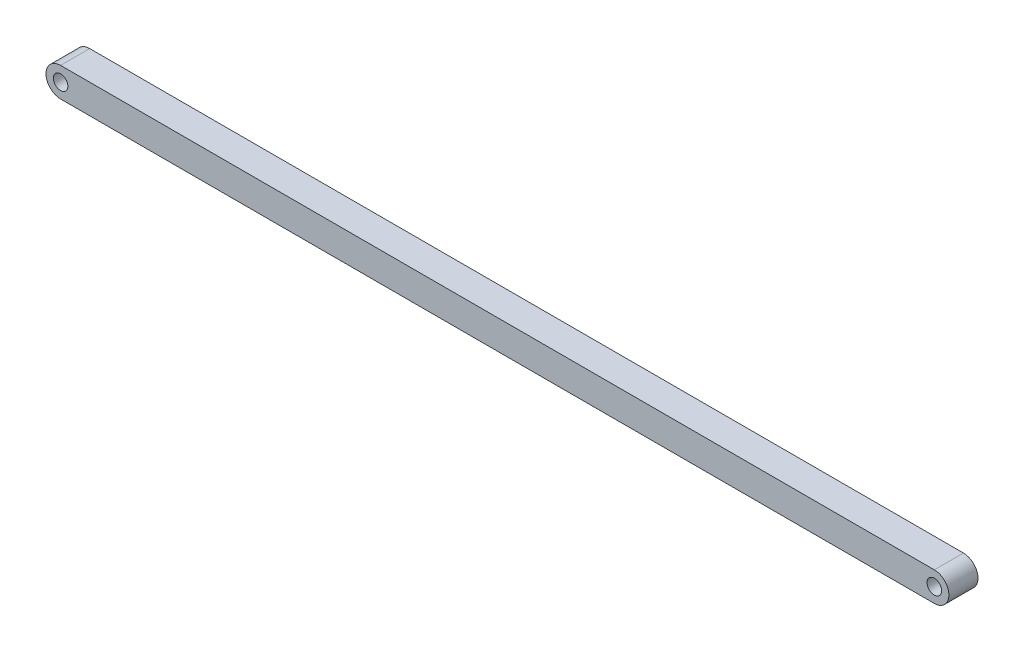
ISO-10303-21;
HEADER;
FILE_DESCRIPTION(('STEP AP214'),'2;1');
FILE_NAME('part.step','',(''),(''),'','','');
FILE_SCHEMA(('AUTOMOTIVE_DESIGN { 1 0 10303 214 1 1 1 1 }'));
ENDSEC;
DATA;
#1=APPLICATION_CONTEXT('core data for automotive mechanical design processes');
#2=APPLICATION_PROTOCOL_DEFINITION('international standard','automotive_design',2000,#1);
#3=PRODUCT_CONTEXT('',#1,'mechanical');
#4=PRODUCT('Part','Part','',(#3));
#5=PRODUCT_RELATED_PRODUCT_CATEGORY('part','',(#4));
#6=PRODUCT_DEFINITION_FORMATION('','',#4);
#7=PRODUCT_DEFINITION_CONTEXT('part definition',#1,'design');
#8=PRODUCT_DEFINITION('design','',#6,#7);
#9=PRODUCT_DEFINITION_SHAPE('','',#8);
#10=(LENGTH_UNIT() NAMED_UNIT(*) SI_UNIT(.MILLI.,.METRE.));
#11=(NAMED_UNIT(*) PLANE_ANGLE_UNIT() SI_UNIT($,.RADIAN.));
#12=(NAMED_UNIT(*) SI_UNIT($,.STERADIAN.) SOLID_ANGLE_UNIT());
#13=UNCERTAINTY_MEASURE_WITH_UNIT(LENGTH_MEASURE(1.E-05),#10,'distance_accuracy_value','');
#14=(GEOMETRIC_REPRESENTATION_CONTEXT(3) GLOBAL_UNCERTAINTY_ASSIGNED_CONTEXT((#13)) GLOBAL_UNIT_ASSIGNED_CONTEXT((#10,
#11,#12)) REPRESENTATION_CONTEXT('',''));
#15=CARTESIAN_POINT('',(0.,0.,0.));
#16=DIRECTION('',(0.,0.,1.));
#17=DIRECTION('',(1.,0.,0.));
#18=AXIS2_PLACEMENT_3D('',#15,#16,#17);
#19=CARTESIAN_POINT('',(-75.,0.,5.));
#20=DIRECTION('',(0.,0.,1.));
#21=DIRECTION('',(1.,0.,0.));
#22=AXIS2_PLACEMENT_3D('',#19,#20,#21);
#23=PLANE('',#22);
#24=CARTESIAN_POINT('',(75.,0.,5.));
#25=DIRECTION('',(0.,0.,1.));
#26=DIRECTION('',(1.,0.,0.));
#27=AXIS2_PLACEMENT_3D('',#24,#25,#26);
#28=CIRCLE('',#27,1.25);
#29=CARTESIAN_POINT('',(76.25,0.,5.));
#30=VERTEX_POINT('',#29);
#31=EDGE_CURVE('E141',#30,#30,#28,.T.);
#32=ORIENTED_EDGE('',*,*,#31,.F.);
#33=EDGE_LOOP('',(#32));
#34=FACE_BOUND('',#33,.T.);
#35=CARTESIAN_POINT('',(-75.,0.,5.));
#36=DIRECTION('',(0.,0.,1.));
#37=DIRECTION('',(1.,0.,0.));
#38=AXIS2_PLACEMENT_3D('',#35,#36,#37);
#39=CIRCLE('',#38,2.5);
#40=CARTESIAN_POINT('',(-75.,2.5,5.));
#41=VERTEX_POINT('',#40);
#42=CARTESIAN_POINT('',(-75.,-2.5,5.));
#43=VERTEX_POINT('',#42);
#44=EDGE_CURVE('E120',#41,#43,#39,.T.);
#45=ORIENTED_EDGE('',*,*,#44,.T.);
#46=DIRECTION('',(1.,0.,0.));
#47=VECTOR('',#46,1.);
#48=CARTESIAN_POINT('',(-75.,-2.5,5.));
#49=LINE('',#48,#47);
#50=CARTESIAN_POINT('',(75.,-2.49999999999997,5.));
#51=VERTEX_POINT('',#50);
#52=EDGE_CURVE('E113',#43,#51,#49,.T.);
#53=ORIENTED_EDGE('',*,*,#52,.T.);
#54=CARTESIAN_POINT('',(75.,0.,5.));
#55=DIRECTION('',(0.,0.,1.));
#56=DIRECTION('',(1.,0.,0.));
#57=AXIS2_PLACEMENT_3D('',#54,#55,#56);
#58=CIRCLE('',#57,2.5);
#59=CARTESIAN_POINT('',(75.,2.50000000000003,5.));
#60=VERTEX_POINT('',#59);
#61=EDGE_CURVE('E119',#51,#60,#58,.T.);
#62=ORIENTED_EDGE('',*,*,#61,.T.);
#63=DIRECTION('',(1.,0.,0.));
#64=VECTOR('',#63,1.);
#65=CARTESIAN_POINT('',(-75.,2.5,5.));
#66=LINE('',#65,#64);
#67=EDGE_CURVE('E132',#41,#60,#66,.T.);
#68=ORIENTED_EDGE('',*,*,#67,.F.);
#69=EDGE_LOOP('',(#45,#53,#62,#68));
#70=FACE_BOUND('',#69,.T.);
#71=CARTESIAN_POINT('',(-75.,0.,5.));
#72=DIRECTION('',(0.,0.,1.));
#73=DIRECTION('',(1.,0.,0.));
#74=AXIS2_PLACEMENT_3D('',#71,#72,#73);
#75=CIRCLE('',#74,1.25);
#76=CARTESIAN_POINT('',(-73.75,0.,5.));
#77=VERTEX_POINT('',#76);
#78=EDGE_CURVE('E161',#77,#77,#75,.T.);
#79=ORIENTED_EDGE('',*,*,#78,.F.);
#80=EDGE_LOOP('',(#79));
#81=FACE_BOUND('',#80,.T.);
#82=ADVANCED_FACE('F69',(#34,#70,#81),#23,.T.);
#83=CARTESIAN_POINT('',(-75.,0.,0.));
#84=DIRECTION('',(0.,0.,1.));
#85=DIRECTION('',(1.,0.,0.));
#86=AXIS2_PLACEMENT_3D('',#83,#84,#85);
#87=PLANE('',#86);
#88=CARTESIAN_POINT('',(-75.,0.,0.));
#89=DIRECTION('',(0.,0.,1.));
#90=DIRECTION('',(1.,0.,0.));
#91=AXIS2_PLACEMENT_3D('',#88,#89,#90);
#92=CIRCLE('',#91,2.5);
#93=CARTESIAN_POINT('',(-75.,2.5,0.));
#94=VERTEX_POINT('',#93);
#95=CARTESIAN_POINT('',(-75.,-2.5,0.));
#96=VERTEX_POINT('',#95);
#97=EDGE_CURVE('E138',#94,#96,#92,.T.);
#98=ORIENTED_EDGE('',*,*,#97,.F.);
#99=DIRECTION('',(1.,0.,0.));
#100=VECTOR('',#99,1.);
#101=CARTESIAN_POINT('',(-75.,2.5,0.));
#102=LINE('',#101,#100);
#103=CARTESIAN_POINT('',(75.,2.50000000000003,0.));
#104=VERTEX_POINT('',#103);
#105=EDGE_CURVE('E147',#94,#104,#102,.T.);
#106=ORIENTED_EDGE('',*,*,#105,.T.);
#107=CARTESIAN_POINT('',(75.,0.,0.));
#108=DIRECTION('',(0.,0.,1.));
#109=DIRECTION('',(1.,0.,0.));
#110=AXIS2_PLACEMENT_3D('',#107,#108,#109);
#111=CIRCLE('',#110,2.5);
#112=CARTESIAN_POINT('',(75.,-2.49999999999997,0.));
#113=VERTEX_POINT('',#112);
#114=EDGE_CURVE('E144',#113,#104,#111,.T.);
#115=ORIENTED_EDGE('',*,*,#114,.F.);
#116=DIRECTION('',(1.,0.,0.));
#117=VECTOR('',#116,1.);
#118=CARTESIAN_POINT('',(-75.,-2.5,0.));
#119=LINE('',#118,#117);
#120=EDGE_CURVE('E126',#96,#113,#119,.T.);
#121=ORIENTED_EDGE('',*,*,#120,.F.);
#122=EDGE_LOOP('',(#98,#106,#115,#121));
#123=FACE_BOUND('',#122,.T.);
#124=CARTESIAN_POINT('',(75.,0.,0.));
#125=DIRECTION('',(0.,0.,1.));
#126=DIRECTION('',(1.,0.,0.));
#127=AXIS2_PLACEMENT_3D('',#124,#125,#126);
#128=CIRCLE('',#127,1.25);
#129=CARTESIAN_POINT('',(76.25,0.,0.));
#130=VERTEX_POINT('',#129);
#131=EDGE_CURVE('E157',#130,#130,#128,.T.);
#132=ORIENTED_EDGE('',*,*,#131,.T.);
#133=EDGE_LOOP('',(#132));
#134=FACE_BOUND('',#133,.T.);
#135=CARTESIAN_POINT('',(-75.,0.,0.));
#136=DIRECTION('',(0.,0.,1.));
#137=DIRECTION('',(1.,0.,0.));
#138=AXIS2_PLACEMENT_3D('',#135,#136,#137);
#139=CIRCLE('',#138,1.25);
#140=CARTESIAN_POINT('',(-73.75,0.,0.));
#141=VERTEX_POINT('',#140);
#142=EDGE_CURVE('E165',#141,#141,#139,.T.);
#143=ORIENTED_EDGE('',*,*,#142,.T.);
#144=EDGE_LOOP('',(#143));
#145=FACE_BOUND('',#144,.T.);
#146=ADVANCED_FACE('F176',(#123,#134,#145),#87,.F.);
#147=CARTESIAN_POINT('',(-75.,0.,5.));
#148=DIRECTION('',(0.,0.,-1.));
#149=DIRECTION('',(-1.,0.,0.));
#150=AXIS2_PLACEMENT_3D('',#147,#148,#149);
#151=CYLINDRICAL_SURFACE('',#150,2.5);
#152=ORIENTED_EDGE('',*,*,#97,.T.);
#153=DIRECTION('',(0.,0.,-1.));
#154=VECTOR('',#153,1.);
#155=CARTESIAN_POINT('',(-75.,-2.5,5.));
#156=LINE('',#155,#154);
#157=EDGE_CURVE('E12',#43,#96,#156,.T.);
#158=ORIENTED_EDGE('',*,*,#157,.F.);
#159=ORIENTED_EDGE('',*,*,#44,.F.);
#160=DIRECTION('',(0.,0.,-1.));
#161=VECTOR('',#160,1.);
#162=CARTESIAN_POINT('',(-75.,2.5,5.));
#163=LINE('',#162,#161);
#164=EDGE_CURVE('E87',#41,#94,#163,.T.);
#165=ORIENTED_EDGE('',*,*,#164,.T.);
#166=EDGE_LOOP('',(#152,#158,#159,#165));
#167=FACE_BOUND('',#166,.T.);
#168=ADVANCED_FACE('F71',(#167),#151,.T.);
#169=CARTESIAN_POINT('',(-75.,-2.5,5.));
#170=DIRECTION('',(0.,1.,0.));
#171=DIRECTION('',(-1.,0.,0.));
#172=AXIS2_PLACEMENT_3D('',#169,#170,#171);
#173=PLANE('',#172);
#174=ORIENTED_EDGE('',*,*,#120,.T.);
#175=DIRECTION('',(0.,0.,-1.));
#176=VECTOR('',#175,1.);
#177=CARTESIAN_POINT('',(75.,-2.49999999999997,5.));
#178=LINE('',#177,#176);
#179=EDGE_CURVE('E79',#51,#113,#178,.T.);
#180=ORIENTED_EDGE('',*,*,#179,.F.);
#181=ORIENTED_EDGE('',*,*,#52,.F.);
#182=ORIENTED_EDGE('',*,*,#157,.T.);
#183=EDGE_LOOP('',(#174,#180,#181,#182));
#184=FACE_BOUND('',#183,.T.);
#185=ADVANCED_FACE('F125',(#184),#173,.F.);
#186=CARTESIAN_POINT('',(75.,0.,5.));
#187=DIRECTION('',(0.,0.,-1.));
#188=DIRECTION('',(-1.,0.,0.));
#189=AXIS2_PLACEMENT_3D('',#186,#187,#188);
#190=CYLINDRICAL_SURFACE('',#189,2.5);
#191=ORIENTED_EDGE('',*,*,#114,.T.);
#192=DIRECTION('',(0.,0.,-1.));
#193=VECTOR('',#192,1.);
#194=CARTESIAN_POINT('',(75.,2.50000000000003,5.));
#195=LINE('',#194,#193);
#196=EDGE_CURVE('E102',#60,#104,#195,.T.);
#197=ORIENTED_EDGE('',*,*,#196,.F.);
#198=ORIENTED_EDGE('',*,*,#61,.F.);
#199=ORIENTED_EDGE('',*,*,#179,.T.);
#200=EDGE_LOOP('',(#191,#197,#198,#199));
#201=FACE_BOUND('',#200,.T.);
#202=ADVANCED_FACE('F130',(#201),#190,.T.);
#203=CARTESIAN_POINT('',(-75.,2.5,5.));
#204=DIRECTION('',(0.,1.,0.));
#205=DIRECTION('',(-1.,0.,0.));
#206=AXIS2_PLACEMENT_3D('',#203,#204,#205);
#207=PLANE('',#206);
#208=ORIENTED_EDGE('',*,*,#105,.F.);
#209=ORIENTED_EDGE('',*,*,#164,.F.);
#210=ORIENTED_EDGE('',*,*,#67,.T.);
#211=ORIENTED_EDGE('',*,*,#196,.T.);
#212=EDGE_LOOP('',(#208,#209,#210,#211));
#213=FACE_BOUND('',#212,.T.);
#214=ADVANCED_FACE('F188',(#213),#207,.T.);
#215=CARTESIAN_POINT('',(75.,0.,5.));
#216=DIRECTION('',(0.,0.,-1.));
#217=DIRECTION('',(-1.,0.,0.));
#218=AXIS2_PLACEMENT_3D('',#215,#216,#217);
#219=CYLINDRICAL_SURFACE('',#218,1.25);
#220=ORIENTED_EDGE('',*,*,#31,.T.);
#221=EDGE_LOOP('',(#220));
#222=FACE_BOUND('',#221,.T.);
#223=ORIENTED_EDGE('',*,*,#131,.F.);
#224=EDGE_LOOP('',(#223));
#225=FACE_BOUND('',#224,.T.);
#226=ADVANCED_FACE('F185',(#222,#225),#219,.F.);
#227=CARTESIAN_POINT('',(-75.,0.,5.));
#228=DIRECTION('',(0.,0.,-1.));
#229=DIRECTION('',(-1.,0.,0.));
#230=AXIS2_PLACEMENT_3D('',#227,#228,#229);
#231=CYLINDRICAL_SURFACE('',#230,1.25);
#232=ORIENTED_EDGE('',*,*,#78,.T.);
#233=EDGE_LOOP('',(#232));
#234=FACE_BOUND('',#233,.T.);
#235=ORIENTED_EDGE('',*,*,#142,.F.);
#236=EDGE_LOOP('',(#235));
#237=FACE_BOUND('',#236,.T.);
#238=ADVANCED_FACE('F173',(#234,#237),#231,.F.);
#239=CLOSED_SHELL('',(#82,#146,#168,#185,#202,#214,#226,#238));
#240=MANIFOLD_SOLID_BREP('B2',#239);
#241=ADVANCED_BREP_SHAPE_REPRESENTATION('',(#18,#240),#14);
#242=SHAPE_DEFINITION_REPRESENTATION(#9,#241);
ENDSEC;
END-ISO-10303-21;
